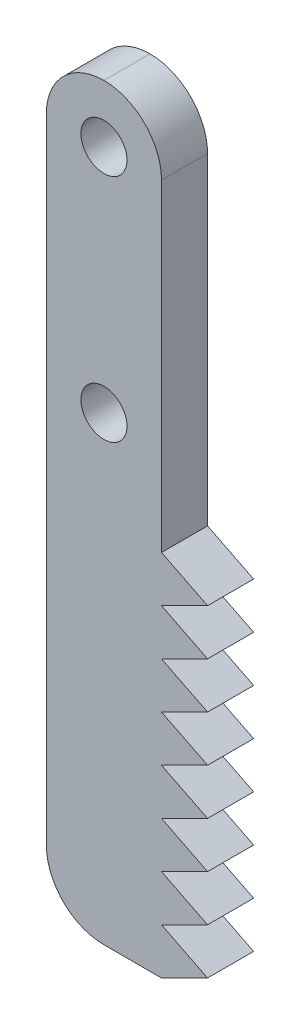
ISO-10303-21;
HEADER;
FILE_DESCRIPTION(('STEP AP214'),'2;1');
FILE_NAME('part.step','',(''),(''),'','','');
FILE_SCHEMA(('AUTOMOTIVE_DESIGN { 1 0 10303 214 1 1 1 1 }'));
ENDSEC;
DATA;
#1=APPLICATION_CONTEXT('core data for automotive mechanical design processes');
#2=APPLICATION_PROTOCOL_DEFINITION('international standard','automotive_design',2000,#1);
#3=PRODUCT_CONTEXT('',#1,'mechanical');
#4=PRODUCT('Part','Part','',(#3));
#5=PRODUCT_RELATED_PRODUCT_CATEGORY('part','',(#4));
#6=PRODUCT_DEFINITION_FORMATION('','',#4);
#7=PRODUCT_DEFINITION_CONTEXT('part definition',#1,'design');
#8=PRODUCT_DEFINITION('design','',#6,#7);
#9=PRODUCT_DEFINITION_SHAPE('','',#8);
#10=(LENGTH_UNIT() NAMED_UNIT(*) SI_UNIT(.MILLI.,.METRE.));
#11=(NAMED_UNIT(*) PLANE_ANGLE_UNIT() SI_UNIT($,.RADIAN.));
#12=(NAMED_UNIT(*) SI_UNIT($,.STERADIAN.) SOLID_ANGLE_UNIT());
#13=UNCERTAINTY_MEASURE_WITH_UNIT(LENGTH_MEASURE(1.E-05),#10,'distance_accuracy_value','');
#14=(GEOMETRIC_REPRESENTATION_CONTEXT(3) GLOBAL_UNCERTAINTY_ASSIGNED_CONTEXT((#13)) GLOBAL_UNIT_ASSIGNED_CONTEXT((#10,
#11,#12)) REPRESENTATION_CONTEXT('',''));
#15=CARTESIAN_POINT('',(0.,0.,0.));
#16=DIRECTION('',(0.,0.,1.));
#17=DIRECTION('',(1.,0.,0.));
#18=AXIS2_PLACEMENT_3D('',#15,#16,#17);
#19=CARTESIAN_POINT('',(-25.,0.,20.));
#20=DIRECTION('',(1.,0.,0.));
#21=DIRECTION('',(0.,1.,0.));
#22=AXIS2_PLACEMENT_3D('',#19,#20,#21);
#23=PLANE('',#22);
#24=DIRECTION('',(0.,-1.,0.));
#25=VECTOR('',#24,1.);
#26=CARTESIAN_POINT('',(-25.,0.,0.));
#27=LINE('',#26,#25);
#28=CARTESIAN_POINT('',(-25.,137.5,0.));
#29=VERTEX_POINT('',#28);
#30=CARTESIAN_POINT('',(-25.,-137.5,0.));
#31=VERTEX_POINT('',#30);
#32=EDGE_CURVE('E244',#29,#31,#27,.T.);
#33=ORIENTED_EDGE('',*,*,#32,.T.);
#34=DIRECTION('',(0.,0.,-1.));
#35=VECTOR('',#34,1.);
#36=CARTESIAN_POINT('',(-25.,-137.5,20.));
#37=LINE('',#36,#35);
#38=CARTESIAN_POINT('',(-25.,-137.5,20.));
#39=VERTEX_POINT('',#38);
#40=EDGE_CURVE('E223',#31,#39,#37,.F.);
#41=ORIENTED_EDGE('',*,*,#40,.T.);
#42=DIRECTION('',(0.,-1.,0.));
#43=VECTOR('',#42,1.);
#44=CARTESIAN_POINT('',(-25.,0.,20.));
#45=LINE('',#44,#43);
#46=CARTESIAN_POINT('',(-25.,137.5,20.));
#47=VERTEX_POINT('',#46);
#48=EDGE_CURVE('E193',#47,#39,#45,.T.);
#49=ORIENTED_EDGE('',*,*,#48,.F.);
#50=DIRECTION('',(0.,0.,-1.));
#51=VECTOR('',#50,1.);
#52=CARTESIAN_POINT('',(-25.,137.5,0.));
#53=LINE('',#52,#51);
#54=EDGE_CURVE('E221',#47,#29,#53,.T.);
#55=ORIENTED_EDGE('',*,*,#54,.T.);
#56=EDGE_LOOP('',(#33,#41,#49,#55));
#57=FACE_BOUND('',#56,.T.);
#58=ADVANCED_FACE('F32',(#57),#23,.F.);
#59=CARTESIAN_POINT('',(0.,-162.5,20.));
#60=DIRECTION('',(0.,1.,0.));
#61=DIRECTION('',(0.,0.,1.));
#62=AXIS2_PLACEMENT_3D('',#59,#60,#61);
#63=PLANE('',#62);
#64=DIRECTION('',(1.,0.,0.));
#65=VECTOR('',#64,1.);
#66=CARTESIAN_POINT('',(0.,-162.5,20.));
#67=LINE('',#66,#65);
#68=CARTESIAN_POINT('',(0.,-162.5,20.));
#69=VERTEX_POINT('',#68);
#70=CARTESIAN_POINT('',(25.,-162.5,20.));
#71=VERTEX_POINT('',#70);
#72=EDGE_CURVE('E180',#69,#71,#67,.T.);
#73=ORIENTED_EDGE('',*,*,#72,.F.);
#74=DIRECTION('',(0.,0.,-1.));
#75=VECTOR('',#74,1.);
#76=CARTESIAN_POINT('',(0.,-162.5,20.));
#77=LINE('',#76,#75);
#78=CARTESIAN_POINT('',(0.,-162.5,0.));
#79=VERTEX_POINT('',#78);
#80=EDGE_CURVE('E208',#69,#79,#77,.T.);
#81=ORIENTED_EDGE('',*,*,#80,.T.);
#82=DIRECTION('',(1.,0.,0.));
#83=VECTOR('',#82,1.);
#84=CARTESIAN_POINT('',(0.,-162.5,0.));
#85=LINE('',#84,#83);
#86=CARTESIAN_POINT('',(25.,-162.5,0.));
#87=VERTEX_POINT('',#86);
#88=EDGE_CURVE('E206',#79,#87,#85,.T.);
#89=ORIENTED_EDGE('',*,*,#88,.T.);
#90=DIRECTION('',(0.,0.,-1.));
#91=VECTOR('',#90,1.);
#92=CARTESIAN_POINT('',(25.,-162.5,20.));
#93=LINE('',#92,#91);
#94=EDGE_CURVE('E199',#71,#87,#93,.T.);
#95=ORIENTED_EDGE('',*,*,#94,.F.);
#96=EDGE_LOOP('',(#73,#81,#89,#95));
#97=FACE_BOUND('',#96,.T.);
#98=ADVANCED_FACE('F204',(#97),#63,.F.);
#99=CARTESIAN_POINT('',(70.,-140.,20.));
#100=DIRECTION('',(-0.447213595499958,0.894427190999916,0.));
#101=DIRECTION('',(-0.894427190999916,-0.447213595499958,0.));
#102=AXIS2_PLACEMENT_3D('',#99,#100,#101);
#103=PLANE('',#102);
#104=DIRECTION('',(0.894427190999916,0.447213595499958,0.));
#105=VECTOR('',#104,1.);
#106=CARTESIAN_POINT('',(70.,-140.,0.));
#107=LINE('',#106,#105);
#108=CARTESIAN_POINT('',(45.,-152.5,0.));
#109=VERTEX_POINT('',#108);
#110=EDGE_CURVE('E247',#87,#109,#107,.T.);
#111=ORIENTED_EDGE('',*,*,#110,.T.);
#112=DIRECTION('',(0.,0.,-1.));
#113=VECTOR('',#112,1.);
#114=CARTESIAN_POINT('',(45.,-152.5,20.));
#115=LINE('',#114,#113);
#116=CARTESIAN_POINT('',(45.,-152.5,20.));
#117=VERTEX_POINT('',#116);
#118=EDGE_CURVE('E201',#117,#109,#115,.T.);
#119=ORIENTED_EDGE('',*,*,#118,.F.);
#120=DIRECTION('',(0.894427190999916,0.447213595499958,0.));
#121=VECTOR('',#120,1.);
#122=CARTESIAN_POINT('',(70.,-140.,20.));
#123=LINE('',#122,#121);
#124=EDGE_CURVE('E186',#71,#117,#123,.T.);
#125=ORIENTED_EDGE('',*,*,#124,.F.);
#126=ORIENTED_EDGE('',*,*,#94,.T.);
#127=EDGE_LOOP('',(#111,#119,#125,#126));
#128=FACE_BOUND('',#127,.T.);
#129=ADVANCED_FACE('F198',(#128),#103,.F.);
#130=CARTESIAN_POINT('',(-52.,-104.,20.));
#131=DIRECTION('',(-0.447213595499958,-0.894427190999916,0.));
#132=DIRECTION('',(0.894427190999916,-0.447213595499958,0.));
#133=AXIS2_PLACEMENT_3D('',#130,#131,#132);
#134=PLANE('',#133);
#135=DIRECTION('',(-0.894427190999916,0.447213595499958,0.));
#136=VECTOR('',#135,1.);
#137=CARTESIAN_POINT('',(-52.,-104.,0.));
#138=LINE('',#137,#136);
#139=CARTESIAN_POINT('',(25.,-142.5,0.));
#140=VERTEX_POINT('',#139);
#141=EDGE_CURVE('E254',#109,#140,#138,.T.);
#142=ORIENTED_EDGE('',*,*,#141,.T.);
#143=DIRECTION('',(0.,0.,-1.));
#144=VECTOR('',#143,1.);
#145=CARTESIAN_POINT('',(25.,-142.5,20.));
#146=LINE('',#145,#144);
#147=CARTESIAN_POINT('',(25.,-142.5,20.));
#148=VERTEX_POINT('',#147);
#149=EDGE_CURVE('E212',#148,#140,#146,.T.);
#150=ORIENTED_EDGE('',*,*,#149,.F.);
#151=DIRECTION('',(-0.894427190999916,0.447213595499958,0.));
#152=VECTOR('',#151,1.);
#153=CARTESIAN_POINT('',(-52.,-104.,20.));
#154=LINE('',#153,#152);
#155=EDGE_CURVE('E202',#117,#148,#154,.T.);
#156=ORIENTED_EDGE('',*,*,#155,.F.);
#157=ORIENTED_EDGE('',*,*,#118,.T.);
#158=EDGE_LOOP('',(#142,#150,#156,#157));
#159=FACE_BOUND('',#158,.T.);
#160=ADVANCED_FACE('F354',(#159),#134,.F.);
#161=CARTESIAN_POINT('',(61.9999999999998,-124.,20.));
#162=DIRECTION('',(-0.447213595499957,0.894427190999917,0.));
#163=DIRECTION('',(-0.894427190999917,-0.447213595499957,0.));
#164=AXIS2_PLACEMENT_3D('',#161,#162,#163);
#165=PLANE('',#164);
#166=DIRECTION('',(0.894427190999917,0.447213595499957,0.));
#167=VECTOR('',#166,1.);
#168=CARTESIAN_POINT('',(61.9999999999998,-124.,0.));
#169=LINE('',#168,#167);
#170=CARTESIAN_POINT('',(45.,-132.5,0.));
#171=VERTEX_POINT('',#170);
#172=EDGE_CURVE('E257',#140,#171,#169,.T.);
#173=ORIENTED_EDGE('',*,*,#172,.T.);
#174=DIRECTION('',(0.,0.,-1.));
#175=VECTOR('',#174,1.);
#176=CARTESIAN_POINT('',(45.,-132.5,20.));
#177=LINE('',#176,#175);
#178=CARTESIAN_POINT('',(45.,-132.5,20.));
#179=VERTEX_POINT('',#178);
#180=EDGE_CURVE('E344',#179,#171,#177,.T.);
#181=ORIENTED_EDGE('',*,*,#180,.F.);
#182=DIRECTION('',(0.894427190999917,0.447213595499957,0.));
#183=VECTOR('',#182,1.);
#184=CARTESIAN_POINT('',(61.9999999999998,-124.,20.));
#185=LINE('',#184,#183);
#186=EDGE_CURVE('E352',#148,#179,#185,.T.);
#187=ORIENTED_EDGE('',*,*,#186,.F.);
#188=ORIENTED_EDGE('',*,*,#149,.T.);
#189=EDGE_LOOP('',(#173,#181,#187,#188));
#190=FACE_BOUND('',#189,.T.);
#191=ADVANCED_FACE('F349',(#190),#165,.F.);
#192=CARTESIAN_POINT('',(-44.,-87.9999999999998,20.));
#193=DIRECTION('',(-0.447213595499959,-0.894427190999915,0.));
#194=DIRECTION('',(0.894427190999915,-0.447213595499959,0.));
#195=AXIS2_PLACEMENT_3D('',#192,#193,#194);
#196=PLANE('',#195);
#197=DIRECTION('',(-0.894427190999915,0.447213595499959,0.));
#198=VECTOR('',#197,1.);
#199=CARTESIAN_POINT('',(-44.,-87.9999999999998,0.));
#200=LINE('',#199,#198);
#201=CARTESIAN_POINT('',(25.,-122.5,0.));
#202=VERTEX_POINT('',#201);
#203=EDGE_CURVE('E260',#171,#202,#200,.T.);
#204=ORIENTED_EDGE('',*,*,#203,.T.);
#205=DIRECTION('',(0.,0.,-1.));
#206=VECTOR('',#205,1.);
#207=CARTESIAN_POINT('',(25.,-122.5,20.));
#208=LINE('',#207,#206);
#209=CARTESIAN_POINT('',(25.,-122.5,20.));
#210=VERTEX_POINT('',#209);
#211=EDGE_CURVE('E341',#210,#202,#208,.T.);
#212=ORIENTED_EDGE('',*,*,#211,.F.);
#213=DIRECTION('',(-0.894427190999915,0.447213595499959,0.));
#214=VECTOR('',#213,1.);
#215=CARTESIAN_POINT('',(-44.,-87.9999999999998,20.));
#216=LINE('',#215,#214);
#217=EDGE_CURVE('E359',#179,#210,#216,.T.);
#218=ORIENTED_EDGE('',*,*,#217,.F.);
#219=ORIENTED_EDGE('',*,*,#180,.T.);
#220=EDGE_LOOP('',(#204,#212,#218,#219));
#221=FACE_BOUND('',#220,.T.);
#222=ADVANCED_FACE('F357',(#221),#196,.F.);
#223=CARTESIAN_POINT('',(53.9999999999998,-108.,20.));
#224=DIRECTION('',(-0.447213595499957,0.894427190999917,0.));
#225=DIRECTION('',(-0.894427190999917,-0.447213595499957,0.));
#226=AXIS2_PLACEMENT_3D('',#223,#224,#225);
#227=PLANE('',#226);
#228=DIRECTION('',(0.894427190999917,0.447213595499957,0.));
#229=VECTOR('',#228,1.);
#230=CARTESIAN_POINT('',(53.9999999999998,-108.,0.));
#231=LINE('',#230,#229);
#232=CARTESIAN_POINT('',(45.,-112.5,0.));
#233=VERTEX_POINT('',#232);
#234=EDGE_CURVE('E263',#202,#233,#231,.T.);
#235=ORIENTED_EDGE('',*,*,#234,.T.);
#236=DIRECTION('',(0.,0.,-1.));
#237=VECTOR('',#236,1.);
#238=CARTESIAN_POINT('',(45.,-112.5,20.));
#239=LINE('',#238,#237);
#240=CARTESIAN_POINT('',(45.,-112.5,20.));
#241=VERTEX_POINT('',#240);
#242=EDGE_CURVE('E338',#241,#233,#239,.T.);
#243=ORIENTED_EDGE('',*,*,#242,.F.);
#244=DIRECTION('',(0.894427190999917,0.447213595499957,0.));
#245=VECTOR('',#244,1.);
#246=CARTESIAN_POINT('',(53.9999999999998,-108.,20.));
#247=LINE('',#246,#245);
#248=EDGE_CURVE('E361',#210,#241,#247,.T.);
#249=ORIENTED_EDGE('',*,*,#248,.F.);
#250=ORIENTED_EDGE('',*,*,#211,.T.);
#251=EDGE_LOOP('',(#235,#243,#249,#250));
#252=FACE_BOUND('',#251,.T.);
#253=ADVANCED_FACE('F599',(#252),#227,.F.);
#254=CARTESIAN_POINT('',(-35.9999999999999,-72.0000000000002,20.));
#255=DIRECTION('',(-0.447213595499956,-0.894427190999917,0.));
#256=DIRECTION('',(0.894427190999917,-0.447213595499956,0.));
#257=AXIS2_PLACEMENT_3D('',#254,#255,#256);
#258=PLANE('',#257);
#259=DIRECTION('',(-0.894427190999917,0.447213595499956,0.));
#260=VECTOR('',#259,1.);
#261=CARTESIAN_POINT('',(-35.9999999999999,-72.0000000000002,0.));
#262=LINE('',#261,#260);
#263=CARTESIAN_POINT('',(25.,-102.5,0.));
#264=VERTEX_POINT('',#263);
#265=EDGE_CURVE('E266',#233,#264,#262,.T.);
#266=ORIENTED_EDGE('',*,*,#265,.T.);
#267=DIRECTION('',(0.,0.,-1.));
#268=VECTOR('',#267,1.);
#269=CARTESIAN_POINT('',(25.,-102.5,20.));
#270=LINE('',#269,#268);
#271=CARTESIAN_POINT('',(25.,-102.5,20.));
#272=VERTEX_POINT('',#271);
#273=EDGE_CURVE('E335',#272,#264,#270,.T.);
#274=ORIENTED_EDGE('',*,*,#273,.F.);
#275=DIRECTION('',(-0.894427190999917,0.447213595499956,0.));
#276=VECTOR('',#275,1.);
#277=CARTESIAN_POINT('',(-35.9999999999999,-72.0000000000002,20.));
#278=LINE('',#277,#276);
#279=EDGE_CURVE('E367',#241,#272,#278,.T.);
#280=ORIENTED_EDGE('',*,*,#279,.F.);
#281=ORIENTED_EDGE('',*,*,#242,.T.);
#282=EDGE_LOOP('',(#266,#274,#280,#281));
#283=FACE_BOUND('',#282,.T.);
#284=ADVANCED_FACE('F589',(#283),#258,.F.);
#285=CARTESIAN_POINT('',(46.,-92.,20.));
#286=DIRECTION('',(-0.447213595499958,0.894427190999916,0.));
#287=DIRECTION('',(-0.894427190999916,-0.447213595499958,0.));
#288=AXIS2_PLACEMENT_3D('',#285,#286,#287);
#289=PLANE('',#288);
#290=DIRECTION('',(0.894427190999916,0.447213595499958,0.));
#291=VECTOR('',#290,1.);
#292=CARTESIAN_POINT('',(46.,-92.,0.));
#293=LINE('',#292,#291);
#294=CARTESIAN_POINT('',(45.,-92.5,0.));
#295=VERTEX_POINT('',#294);
#296=EDGE_CURVE('E269',#264,#295,#293,.T.);
#297=ORIENTED_EDGE('',*,*,#296,.T.);
#298=DIRECTION('',(0.,0.,-1.));
#299=VECTOR('',#298,1.);
#300=CARTESIAN_POINT('',(45.,-92.5,20.));
#301=LINE('',#300,#299);
#302=CARTESIAN_POINT('',(45.,-92.5,20.));
#303=VERTEX_POINT('',#302);
#304=EDGE_CURVE('E332',#303,#295,#301,.T.);
#305=ORIENTED_EDGE('',*,*,#304,.F.);
#306=DIRECTION('',(0.894427190999916,0.447213595499958,0.));
#307=VECTOR('',#306,1.);
#308=CARTESIAN_POINT('',(46.,-92.,20.));
#309=LINE('',#308,#307);
#310=EDGE_CURVE('E370',#272,#303,#309,.T.);
#311=ORIENTED_EDGE('',*,*,#310,.F.);
#312=ORIENTED_EDGE('',*,*,#273,.T.);
#313=EDGE_LOOP('',(#297,#305,#311,#312));
#314=FACE_BOUND('',#313,.T.);
#315=ADVANCED_FACE('F579',(#314),#289,.F.);
#316=CARTESIAN_POINT('',(-28.,-56.0000000000002,20.));
#317=DIRECTION('',(-0.447213595499956,-0.894427190999917,0.));
#318=DIRECTION('',(0.894427190999917,-0.447213595499956,0.));
#319=AXIS2_PLACEMENT_3D('',#316,#317,#318);
#320=PLANE('',#319);
#321=DIRECTION('',(-0.894427190999917,0.447213595499956,0.));
#322=VECTOR('',#321,1.);
#323=CARTESIAN_POINT('',(-28.,-56.0000000000002,0.));
#324=LINE('',#323,#322);
#325=CARTESIAN_POINT('',(25.,-82.5,0.));
#326=VERTEX_POINT('',#325);
#327=EDGE_CURVE('E272',#295,#326,#324,.T.);
#328=ORIENTED_EDGE('',*,*,#327,.T.);
#329=DIRECTION('',(0.,0.,-1.));
#330=VECTOR('',#329,1.);
#331=CARTESIAN_POINT('',(25.,-82.5,20.));
#332=LINE('',#331,#330);
#333=CARTESIAN_POINT('',(25.,-82.5,20.));
#334=VERTEX_POINT('',#333);
#335=EDGE_CURVE('E329',#334,#326,#332,.T.);
#336=ORIENTED_EDGE('',*,*,#335,.F.);
#337=DIRECTION('',(-0.894427190999917,0.447213595499956,0.));
#338=VECTOR('',#337,1.);
#339=CARTESIAN_POINT('',(-28.,-56.0000000000002,20.));
#340=LINE('',#339,#338);
#341=EDGE_CURVE('E373',#303,#334,#340,.T.);
#342=ORIENTED_EDGE('',*,*,#341,.F.);
#343=ORIENTED_EDGE('',*,*,#304,.T.);
#344=EDGE_LOOP('',(#328,#336,#342,#343));
#345=FACE_BOUND('',#344,.T.);
#346=ADVANCED_FACE('F569',(#345),#320,.F.);
#347=CARTESIAN_POINT('',(38.,-76.,20.));
#348=DIRECTION('',(-0.447213595499958,0.894427190999916,0.));
#349=DIRECTION('',(-0.894427190999916,-0.447213595499958,0.));
#350=AXIS2_PLACEMENT_3D('',#347,#348,#349);
#351=PLANE('',#350);
#352=DIRECTION('',(0.894427190999916,0.447213595499958,0.));
#353=VECTOR('',#352,1.);
#354=CARTESIAN_POINT('',(38.,-76.,0.));
#355=LINE('',#354,#353);
#356=CARTESIAN_POINT('',(45.,-72.5,0.));
#357=VERTEX_POINT('',#356);
#358=EDGE_CURVE('E275',#326,#357,#355,.T.);
#359=ORIENTED_EDGE('',*,*,#358,.T.);
#360=DIRECTION('',(0.,0.,-1.));
#361=VECTOR('',#360,1.);
#362=CARTESIAN_POINT('',(45.,-72.5,20.));
#363=LINE('',#362,#361);
#364=CARTESIAN_POINT('',(45.,-72.5,20.));
#365=VERTEX_POINT('',#364);
#366=EDGE_CURVE('E326',#365,#357,#363,.T.);
#367=ORIENTED_EDGE('',*,*,#366,.F.);
#368=DIRECTION('',(0.894427190999916,0.447213595499958,0.));
#369=VECTOR('',#368,1.);
#370=CARTESIAN_POINT('',(38.,-76.,20.));
#371=LINE('',#370,#369);
#372=EDGE_CURVE('E376',#334,#365,#371,.T.);
#373=ORIENTED_EDGE('',*,*,#372,.F.);
#374=ORIENTED_EDGE('',*,*,#335,.T.);
#375=EDGE_LOOP('',(#359,#367,#373,#374));
#376=FACE_BOUND('',#375,.T.);
#377=ADVANCED_FACE('F559',(#376),#351,.F.);
#378=CARTESIAN_POINT('',(-20.,-40.0000000000002,20.));
#379=DIRECTION('',(-0.447213595499956,-0.894427190999917,0.));
#380=DIRECTION('',(0.894427190999917,-0.447213595499956,0.));
#381=AXIS2_PLACEMENT_3D('',#378,#379,#380);
#382=PLANE('',#381);
#383=DIRECTION('',(-0.894427190999917,0.447213595499956,0.));
#384=VECTOR('',#383,1.);
#385=CARTESIAN_POINT('',(-20.,-40.0000000000002,0.));
#386=LINE('',#385,#384);
#387=CARTESIAN_POINT('',(25.,-62.5000000000001,0.));
#388=VERTEX_POINT('',#387);
#389=EDGE_CURVE('E278',#357,#388,#386,.T.);
#390=ORIENTED_EDGE('',*,*,#389,.T.);
#391=DIRECTION('',(0.,0.,-1.));
#392=VECTOR('',#391,1.);
#393=CARTESIAN_POINT('',(25.,-62.5000000000001,20.));
#394=LINE('',#393,#392);
#395=CARTESIAN_POINT('',(25.,-62.5000000000001,20.));
#396=VERTEX_POINT('',#395);
#397=EDGE_CURVE('E323',#396,#388,#394,.T.);
#398=ORIENTED_EDGE('',*,*,#397,.F.);
#399=DIRECTION('',(-0.894427190999917,0.447213595499956,0.));
#400=VECTOR('',#399,1.);
#401=CARTESIAN_POINT('',(-20.,-40.0000000000002,20.));
#402=LINE('',#401,#400);
#403=EDGE_CURVE('E379',#365,#396,#402,.T.);
#404=ORIENTED_EDGE('',*,*,#403,.F.);
#405=ORIENTED_EDGE('',*,*,#366,.T.);
#406=EDGE_LOOP('',(#390,#398,#404,#405));
#407=FACE_BOUND('',#406,.T.);
#408=ADVANCED_FACE('F549',(#407),#382,.F.);
#409=CARTESIAN_POINT('',(30.,-60.,20.));
#410=DIRECTION('',(-0.447213595499958,0.894427190999916,0.));
#411=DIRECTION('',(-0.894427190999916,-0.447213595499958,0.));
#412=AXIS2_PLACEMENT_3D('',#409,#410,#411);
#413=PLANE('',#412);
#414=DIRECTION('',(0.894427190999916,0.447213595499958,0.));
#415=VECTOR('',#414,1.);
#416=CARTESIAN_POINT('',(30.,-60.,0.));
#417=LINE('',#416,#415);
#418=CARTESIAN_POINT('',(44.9999999999999,-52.5,0.));
#419=VERTEX_POINT('',#418);
#420=EDGE_CURVE('E281',#388,#419,#417,.T.);
#421=ORIENTED_EDGE('',*,*,#420,.T.);
#422=DIRECTION('',(0.,0.,-1.));
#423=VECTOR('',#422,1.);
#424=CARTESIAN_POINT('',(44.9999999999999,-52.5,20.));
#425=LINE('',#424,#423);
#426=CARTESIAN_POINT('',(44.9999999999999,-52.5,20.));
#427=VERTEX_POINT('',#426);
#428=EDGE_CURVE('E320',#427,#419,#425,.T.);
#429=ORIENTED_EDGE('',*,*,#428,.F.);
#430=DIRECTION('',(0.894427190999916,0.447213595499958,0.));
#431=VECTOR('',#430,1.);
#432=CARTESIAN_POINT('',(30.,-60.,20.));
#433=LINE('',#432,#431);
#434=EDGE_CURVE('E382',#396,#427,#433,.T.);
#435=ORIENTED_EDGE('',*,*,#434,.F.);
#436=ORIENTED_EDGE('',*,*,#397,.T.);
#437=EDGE_LOOP('',(#421,#429,#435,#436));
#438=FACE_BOUND('',#437,.T.);
#439=ADVANCED_FACE('F539',(#438),#413,.F.);
#440=CARTESIAN_POINT('',(-12.,-24.0000000000002,20.));
#441=DIRECTION('',(-0.447213595499957,-0.894427190999917,0.));
#442=DIRECTION('',(0.894427190999917,-0.447213595499957,0.));
#443=AXIS2_PLACEMENT_3D('',#440,#441,#442);
#444=PLANE('',#443);
#445=DIRECTION('',(-0.894427190999917,0.447213595499957,0.));
#446=VECTOR('',#445,1.);
#447=CARTESIAN_POINT('',(-12.,-24.0000000000002,0.));
#448=LINE('',#447,#446);
#449=CARTESIAN_POINT('',(25.,-42.5000000000001,0.));
#450=VERTEX_POINT('',#449);
#451=EDGE_CURVE('E284',#419,#450,#448,.T.);
#452=ORIENTED_EDGE('',*,*,#451,.T.);
#453=DIRECTION('',(0.,0.,-1.));
#454=VECTOR('',#453,1.);
#455=CARTESIAN_POINT('',(25.,-42.5000000000001,20.));
#456=LINE('',#455,#454);
#457=CARTESIAN_POINT('',(25.,-42.5000000000001,20.));
#458=VERTEX_POINT('',#457);
#459=EDGE_CURVE('E317',#458,#450,#456,.T.);
#460=ORIENTED_EDGE('',*,*,#459,.F.);
#461=DIRECTION('',(-0.894427190999917,0.447213595499957,0.));
#462=VECTOR('',#461,1.);
#463=CARTESIAN_POINT('',(-12.,-24.0000000000002,20.));
#464=LINE('',#463,#462);
#465=EDGE_CURVE('E385',#427,#458,#464,.T.);
#466=ORIENTED_EDGE('',*,*,#465,.F.);
#467=ORIENTED_EDGE('',*,*,#428,.T.);
#468=EDGE_LOOP('',(#452,#460,#466,#467));
#469=FACE_BOUND('',#468,.T.);
#470=ADVANCED_FACE('F529',(#469),#444,.F.);
#471=CARTESIAN_POINT('',(22.,-44.,20.));
#472=DIRECTION('',(-0.447213595499958,0.894427190999916,0.));
#473=DIRECTION('',(-0.894427190999916,-0.447213595499958,0.));
#474=AXIS2_PLACEMENT_3D('',#471,#472,#473);
#475=PLANE('',#474);
#476=DIRECTION('',(0.894427190999916,0.447213595499958,0.));
#477=VECTOR('',#476,1.);
#478=CARTESIAN_POINT('',(22.,-44.,0.));
#479=LINE('',#478,#477);
#480=CARTESIAN_POINT('',(44.9999999999999,-32.5,0.));
#481=VERTEX_POINT('',#480);
#482=EDGE_CURVE('E287',#450,#481,#479,.T.);
#483=ORIENTED_EDGE('',*,*,#482,.T.);
#484=DIRECTION('',(0.,0.,-1.));
#485=VECTOR('',#484,1.);
#486=CARTESIAN_POINT('',(44.9999999999999,-32.5,20.));
#487=LINE('',#486,#485);
#488=CARTESIAN_POINT('',(44.9999999999999,-32.5,20.));
#489=VERTEX_POINT('',#488);
#490=EDGE_CURVE('E314',#489,#481,#487,.T.);
#491=ORIENTED_EDGE('',*,*,#490,.F.);
#492=DIRECTION('',(0.894427190999916,0.447213595499958,0.));
#493=VECTOR('',#492,1.);
#494=CARTESIAN_POINT('',(22.,-44.,20.));
#495=LINE('',#494,#493);
#496=EDGE_CURVE('E388',#458,#489,#495,.T.);
#497=ORIENTED_EDGE('',*,*,#496,.F.);
#498=ORIENTED_EDGE('',*,*,#459,.T.);
#499=EDGE_LOOP('',(#483,#491,#497,#498));
#500=FACE_BOUND('',#499,.T.);
#501=ADVANCED_FACE('F519',(#500),#475,.F.);
#502=CARTESIAN_POINT('',(-4.00000000000006,-8.00000000000013,20.));
#503=DIRECTION('',(-0.447213595499957,-0.894427190999916,0.));
#504=DIRECTION('',(0.894427190999917,-0.447213595499957,0.));
#505=AXIS2_PLACEMENT_3D('',#502,#503,#504);
#506=PLANE('',#505);
#507=DIRECTION('',(-0.894427190999916,0.447213595499957,0.));
#508=VECTOR('',#507,1.);
#509=CARTESIAN_POINT('',(-4.00000000000006,-8.00000000000013,0.));
#510=LINE('',#509,#508);
#511=CARTESIAN_POINT('',(25.,-22.5000000000001,0.));
#512=VERTEX_POINT('',#511);
#513=EDGE_CURVE('E290',#481,#512,#510,.T.);
#514=ORIENTED_EDGE('',*,*,#513,.T.);
#515=DIRECTION('',(0.,0.,-1.));
#516=VECTOR('',#515,1.);
#517=CARTESIAN_POINT('',(25.,-22.5000000000001,20.));
#518=LINE('',#517,#516);
#519=CARTESIAN_POINT('',(25.,-22.5000000000001,20.));
#520=VERTEX_POINT('',#519);
#521=EDGE_CURVE('E311',#520,#512,#518,.T.);
#522=ORIENTED_EDGE('',*,*,#521,.F.);
#523=DIRECTION('',(-0.894427190999916,0.447213595499957,0.));
#524=VECTOR('',#523,1.);
#525=CARTESIAN_POINT('',(-4.00000000000006,-8.00000000000013,20.));
#526=LINE('',#525,#524);
#527=EDGE_CURVE('E391',#489,#520,#526,.T.);
#528=ORIENTED_EDGE('',*,*,#527,.F.);
#529=ORIENTED_EDGE('',*,*,#490,.T.);
#530=EDGE_LOOP('',(#514,#522,#528,#529));
#531=FACE_BOUND('',#530,.T.);
#532=ADVANCED_FACE('F509',(#531),#506,.F.);
#533=CARTESIAN_POINT('',(14.,-28.,20.));
#534=DIRECTION('',(-0.447213595499958,0.894427190999916,0.));
#535=DIRECTION('',(-0.894427190999916,-0.447213595499958,0.));
#536=AXIS2_PLACEMENT_3D('',#533,#534,#535);
#537=PLANE('',#536);
#538=DIRECTION('',(0.894427190999916,0.447213595499958,0.));
#539=VECTOR('',#538,1.);
#540=CARTESIAN_POINT('',(14.,-28.,0.));
#541=LINE('',#540,#539);
#542=CARTESIAN_POINT('',(44.9999999999999,-12.5000000000001,0.));
#543=VERTEX_POINT('',#542);
#544=EDGE_CURVE('E293',#512,#543,#541,.T.);
#545=ORIENTED_EDGE('',*,*,#544,.T.);
#546=DIRECTION('',(0.,0.,-1.));
#547=VECTOR('',#546,1.);
#548=CARTESIAN_POINT('',(44.9999999999999,-12.5000000000001,20.));
#549=LINE('',#548,#547);
#550=CARTESIAN_POINT('',(44.9999999999999,-12.5000000000001,20.));
#551=VERTEX_POINT('',#550);
#552=EDGE_CURVE('E307',#551,#543,#549,.T.);
#553=ORIENTED_EDGE('',*,*,#552,.F.);
#554=DIRECTION('',(0.894427190999916,0.447213595499958,0.));
#555=VECTOR('',#554,1.);
#556=CARTESIAN_POINT('',(14.,-28.,20.));
#557=LINE('',#556,#555);
#558=EDGE_CURVE('E394',#520,#551,#557,.T.);
#559=ORIENTED_EDGE('',*,*,#558,.F.);
#560=ORIENTED_EDGE('',*,*,#521,.T.);
#561=EDGE_LOOP('',(#545,#553,#559,#560));
#562=FACE_BOUND('',#561,.T.);
#563=ADVANCED_FACE('F499',(#562),#537,.F.);
#564=CARTESIAN_POINT('',(3.99999999999995,7.9999999999999,20.));
#565=DIRECTION('',(-0.447213595499958,-0.894427190999916,0.));
#566=DIRECTION('',(0.894427190999916,-0.447213595499958,0.));
#567=AXIS2_PLACEMENT_3D('',#564,#565,#566);
#568=PLANE('',#567);
#569=DIRECTION('',(-0.894427190999916,0.447213595499958,0.));
#570=VECTOR('',#569,1.);
#571=CARTESIAN_POINT('',(3.99999999999995,7.9999999999999,0.));
#572=LINE('',#571,#570);
#573=CARTESIAN_POINT('',(25.,-2.50000000000012,0.));
#574=VERTEX_POINT('',#573);
#575=EDGE_CURVE('E296',#543,#574,#572,.T.);
#576=ORIENTED_EDGE('',*,*,#575,.T.);
#577=DIRECTION('',(0.,0.,-1.));
#578=VECTOR('',#577,1.);
#579=CARTESIAN_POINT('',(25.,-2.50000000000012,20.));
#580=LINE('',#579,#578);
#581=CARTESIAN_POINT('',(25.,-2.50000000000012,20.));
#582=VERTEX_POINT('',#581);
#583=EDGE_CURVE('E304',#582,#574,#580,.T.);
#584=ORIENTED_EDGE('',*,*,#583,.F.);
#585=DIRECTION('',(-0.894427190999916,0.447213595499958,0.));
#586=VECTOR('',#585,1.);
#587=CARTESIAN_POINT('',(3.99999999999995,7.9999999999999,20.));
#588=LINE('',#587,#586);
#589=EDGE_CURVE('E397',#551,#582,#588,.T.);
#590=ORIENTED_EDGE('',*,*,#589,.F.);
#591=ORIENTED_EDGE('',*,*,#552,.T.);
#592=EDGE_LOOP('',(#576,#584,#590,#591));
#593=FACE_BOUND('',#592,.T.);
#594=ADVANCED_FACE('F464',(#593),#568,.F.);
#595=CARTESIAN_POINT('',(25.,0.,20.));
#596=DIRECTION('',(1.,0.,0.));
#597=DIRECTION('',(0.,0.,-1.));
#598=AXIS2_PLACEMENT_3D('',#595,#596,#597);
#599=PLANE('',#598);
#600=DIRECTION('',(0.,-1.,0.));
#601=VECTOR('',#600,1.);
#602=CARTESIAN_POINT('',(25.,0.,0.));
#603=LINE('',#602,#601);
#604=CARTESIAN_POINT('',(25.,137.5,0.));
#605=VERTEX_POINT('',#604);
#606=EDGE_CURVE('E299',#605,#574,#603,.T.);
#607=ORIENTED_EDGE('',*,*,#606,.F.);
#608=DIRECTION('',(0.,0.,-1.));
#609=VECTOR('',#608,1.);
#610=CARTESIAN_POINT('',(25.,137.5,20.));
#611=LINE('',#610,#609);
#612=CARTESIAN_POINT('',(25.,137.5,20.));
#613=VERTEX_POINT('',#612);
#614=EDGE_CURVE('E11',#605,#613,#611,.F.);
#615=ORIENTED_EDGE('',*,*,#614,.T.);
#616=DIRECTION('',(0.,-1.,0.));
#617=VECTOR('',#616,1.);
#618=CARTESIAN_POINT('',(25.,0.,20.));
#619=LINE('',#618,#617);
#620=EDGE_CURVE('E400',#613,#582,#619,.T.);
#621=ORIENTED_EDGE('',*,*,#620,.T.);
#622=ORIENTED_EDGE('',*,*,#583,.T.);
#623=EDGE_LOOP('',(#607,#615,#621,#622));
#624=FACE_BOUND('',#623,.T.);
#625=ADVANCED_FACE('F429',(#624),#599,.T.);
#626=CARTESIAN_POINT('',(0.,37.4999999999999,20.));
#627=DIRECTION('',(0.,0.,-1.));
#628=DIRECTION('',(-1.,0.,0.));
#629=AXIS2_PLACEMENT_3D('',#626,#627,#628);
#630=CYLINDRICAL_SURFACE('',#629,10.);
#631=CARTESIAN_POINT('',(0.,37.4999999999999,20.));
#632=DIRECTION('',(0.,0.,1.));
#633=DIRECTION('',(1.,0.,0.));
#634=AXIS2_PLACEMENT_3D('',#631,#632,#633);
#635=CIRCLE('',#634,10.);
#636=CARTESIAN_POINT('',(10.,37.4999999999999,20.));
#637=VERTEX_POINT('',#636);
#638=EDGE_CURVE('E236',#637,#637,#635,.T.);
#639=ORIENTED_EDGE('',*,*,#638,.T.);
#640=EDGE_LOOP('',(#639));
#641=FACE_BOUND('',#640,.T.);
#642=CARTESIAN_POINT('',(0.,37.4999999999999,0.));
#643=DIRECTION('',(0.,0.,1.));
#644=DIRECTION('',(1.,0.,0.));
#645=AXIS2_PLACEMENT_3D('',#642,#643,#644);
#646=CIRCLE('',#645,10.);
#647=CARTESIAN_POINT('',(10.,37.4999999999999,0.));
#648=VERTEX_POINT('',#647);
#649=EDGE_CURVE('E245',#648,#648,#646,.T.);
#650=ORIENTED_EDGE('',*,*,#649,.F.);
#651=EDGE_LOOP('',(#650));
#652=FACE_BOUND('',#651,.T.);
#653=ADVANCED_FACE('F416',(#641,#652),#630,.F.);
#654=CARTESIAN_POINT('',(0.,137.5,20.));
#655=DIRECTION('',(0.,0.,-1.));
#656=DIRECTION('',(-1.,0.,0.));
#657=AXIS2_PLACEMENT_3D('',#654,#655,#656);
#658=CYLINDRICAL_SURFACE('',#657,10.);
#659=CARTESIAN_POINT('',(0.,137.5,20.));
#660=DIRECTION('',(0.,0.,1.));
#661=DIRECTION('',(1.,0.,0.));
#662=AXIS2_PLACEMENT_3D('',#659,#660,#661);
#663=CIRCLE('',#662,10.);
#664=CARTESIAN_POINT('',(10.,137.5,20.));
#665=VERTEX_POINT('',#664);
#666=EDGE_CURVE('E308',#665,#665,#663,.T.);
#667=ORIENTED_EDGE('',*,*,#666,.T.);
#668=EDGE_LOOP('',(#667));
#669=FACE_BOUND('',#668,.T.);
#670=CARTESIAN_POINT('',(0.,137.5,0.));
#671=DIRECTION('',(0.,0.,1.));
#672=DIRECTION('',(1.,0.,0.));
#673=AXIS2_PLACEMENT_3D('',#670,#671,#672);
#674=CIRCLE('',#673,10.);
#675=CARTESIAN_POINT('',(10.,137.5,0.));
#676=VERTEX_POINT('',#675);
#677=EDGE_CURVE('E301',#676,#676,#674,.T.);
#678=ORIENTED_EDGE('',*,*,#677,.F.);
#679=EDGE_LOOP('',(#678));
#680=FACE_BOUND('',#679,.T.);
#681=ADVANCED_FACE('F404',(#669,#680),#658,.F.);
#682=CARTESIAN_POINT('',(0.,0.,20.));
#683=DIRECTION('',(0.,0.,1.));
#684=DIRECTION('',(1.,0.,0.));
#685=AXIS2_PLACEMENT_3D('',#682,#683,#684);
#686=PLANE('',#685);
#687=ORIENTED_EDGE('',*,*,#638,.F.);
#688=EDGE_LOOP('',(#687));
#689=FACE_BOUND('',#688,.T.);
#690=ORIENTED_EDGE('',*,*,#48,.T.);
#691=CARTESIAN_POINT('',(0.,-137.5,20.));
#692=DIRECTION('',(0.,0.,1.));
#693=DIRECTION('',(1.,0.,0.));
#694=AXIS2_PLACEMENT_3D('',#691,#692,#693);
#695=CIRCLE('',#694,25.);
#696=EDGE_CURVE('E41',#39,#69,#695,.T.);
#697=ORIENTED_EDGE('',*,*,#696,.T.);
#698=ORIENTED_EDGE('',*,*,#72,.T.);
#699=ORIENTED_EDGE('',*,*,#124,.T.);
#700=ORIENTED_EDGE('',*,*,#155,.T.);
#701=ORIENTED_EDGE('',*,*,#186,.T.);
#702=ORIENTED_EDGE('',*,*,#217,.T.);
#703=ORIENTED_EDGE('',*,*,#248,.T.);
#704=ORIENTED_EDGE('',*,*,#279,.T.);
#705=ORIENTED_EDGE('',*,*,#310,.T.);
#706=ORIENTED_EDGE('',*,*,#341,.T.);
#707=ORIENTED_EDGE('',*,*,#372,.T.);
#708=ORIENTED_EDGE('',*,*,#403,.T.);
#709=ORIENTED_EDGE('',*,*,#434,.T.);
#710=ORIENTED_EDGE('',*,*,#465,.T.);
#711=ORIENTED_EDGE('',*,*,#496,.T.);
#712=ORIENTED_EDGE('',*,*,#527,.T.);
#713=ORIENTED_EDGE('',*,*,#558,.T.);
#714=ORIENTED_EDGE('',*,*,#589,.T.);
#715=ORIENTED_EDGE('',*,*,#620,.F.);
#716=CARTESIAN_POINT('',(0.,137.5,20.));
#717=DIRECTION('',(0.,0.,1.));
#718=DIRECTION('',(1.,0.,0.));
#719=AXIS2_PLACEMENT_3D('',#716,#717,#718);
#720=CIRCLE('',#719,25.);
#721=CARTESIAN_POINT('',(0.,162.5,20.));
#722=VERTEX_POINT('',#721);
#723=EDGE_CURVE('E48',#613,#722,#720,.T.);
#724=ORIENTED_EDGE('',*,*,#723,.T.);
#725=CARTESIAN_POINT('',(0.,137.5,20.));
#726=DIRECTION('',(0.,0.,1.));
#727=DIRECTION('',(1.,0.,0.));
#728=AXIS2_PLACEMENT_3D('',#725,#726,#727);
#729=CIRCLE('',#728,25.);
#730=EDGE_CURVE('E225',#722,#47,#729,.T.);
#731=ORIENTED_EDGE('',*,*,#730,.T.);
#732=EDGE_LOOP('',(#690,#697,#698,#699,#700,#701,#702,#703,#704,#705,#706,#707,#708,#709,#710,
#711,#712,#713,#714,#715,#724,#731));
#733=FACE_BOUND('',#732,.T.);
#734=ORIENTED_EDGE('',*,*,#666,.F.);
#735=EDGE_LOOP('',(#734));
#736=FACE_BOUND('',#735,.T.);
#737=ADVANCED_FACE('F183',(#689,#733,#736),#686,.T.);
#738=CARTESIAN_POINT('',(0.,0.,0.));
#739=DIRECTION('',(0.,0.,1.));
#740=DIRECTION('',(1.,0.,0.));
#741=AXIS2_PLACEMENT_3D('',#738,#739,#740);
#742=PLANE('',#741);
#743=ORIENTED_EDGE('',*,*,#649,.T.);
#744=EDGE_LOOP('',(#743));
#745=FACE_BOUND('',#744,.T.);
#746=ORIENTED_EDGE('',*,*,#88,.F.);
#747=CARTESIAN_POINT('',(0.,-137.5,0.));
#748=DIRECTION('',(0.,0.,1.));
#749=DIRECTION('',(1.,0.,0.));
#750=AXIS2_PLACEMENT_3D('',#747,#748,#749);
#751=CIRCLE('',#750,25.);
#752=EDGE_CURVE('E219',#79,#31,#751,.F.);
#753=ORIENTED_EDGE('',*,*,#752,.T.);
#754=ORIENTED_EDGE('',*,*,#32,.F.);
#755=CARTESIAN_POINT('',(0.,137.5,0.));
#756=DIRECTION('',(0.,0.,1.));
#757=DIRECTION('',(1.,0.,0.));
#758=AXIS2_PLACEMENT_3D('',#755,#756,#757);
#759=CIRCLE('',#758,25.);
#760=CARTESIAN_POINT('',(0.,162.5,0.));
#761=VERTEX_POINT('',#760);
#762=EDGE_CURVE('E210',#29,#761,#759,.F.);
#763=ORIENTED_EDGE('',*,*,#762,.T.);
#764=CARTESIAN_POINT('',(0.,137.5,0.));
#765=DIRECTION('',(0.,0.,1.));
#766=DIRECTION('',(1.,0.,0.));
#767=AXIS2_PLACEMENT_3D('',#764,#765,#766);
#768=CIRCLE('',#767,25.);
#769=EDGE_CURVE('E217',#761,#605,#768,.F.);
#770=ORIENTED_EDGE('',*,*,#769,.T.);
#771=ORIENTED_EDGE('',*,*,#606,.T.);
#772=ORIENTED_EDGE('',*,*,#575,.F.);
#773=ORIENTED_EDGE('',*,*,#544,.F.);
#774=ORIENTED_EDGE('',*,*,#513,.F.);
#775=ORIENTED_EDGE('',*,*,#482,.F.);
#776=ORIENTED_EDGE('',*,*,#451,.F.);
#777=ORIENTED_EDGE('',*,*,#420,.F.);
#778=ORIENTED_EDGE('',*,*,#389,.F.);
#779=ORIENTED_EDGE('',*,*,#358,.F.);
#780=ORIENTED_EDGE('',*,*,#327,.F.);
#781=ORIENTED_EDGE('',*,*,#296,.F.);
#782=ORIENTED_EDGE('',*,*,#265,.F.);
#783=ORIENTED_EDGE('',*,*,#234,.F.);
#784=ORIENTED_EDGE('',*,*,#203,.F.);
#785=ORIENTED_EDGE('',*,*,#172,.F.);
#786=ORIENTED_EDGE('',*,*,#141,.F.);
#787=ORIENTED_EDGE('',*,*,#110,.F.);
#788=EDGE_LOOP('',(#746,#753,#754,#763,#770,#771,#772,#773,#774,#775,#776,#777,#778,#779,#780,
#781,#782,#783,#784,#785,#786,#787));
#789=FACE_BOUND('',#788,.T.);
#790=ORIENTED_EDGE('',*,*,#677,.T.);
#791=EDGE_LOOP('',(#790));
#792=FACE_BOUND('',#791,.T.);
#793=ADVANCED_FACE('F241',(#745,#789,#792),#742,.F.);
#794=CARTESIAN_POINT('',(0.,-137.5,20.));
#795=DIRECTION('',(0.,0.,-1.));
#796=DIRECTION('',(-1.,0.,0.));
#797=AXIS2_PLACEMENT_3D('',#794,#795,#796);
#798=CYLINDRICAL_SURFACE('',#797,25.);
#799=ORIENTED_EDGE('',*,*,#696,.F.);
#800=ORIENTED_EDGE('',*,*,#40,.F.);
#801=ORIENTED_EDGE('',*,*,#752,.F.);
#802=ORIENTED_EDGE('',*,*,#80,.F.);
#803=EDGE_LOOP('',(#799,#800,#801,#802));
#804=FACE_BOUND('',#803,.T.);
#805=ADVANCED_FACE('F413',(#804),#798,.T.);
#806=CARTESIAN_POINT('',(0.,137.5,20.));
#807=DIRECTION('',(0.,0.,1.));
#808=DIRECTION('',(1.,0.,0.));
#809=AXIS2_PLACEMENT_3D('',#806,#807,#808);
#810=CYLINDRICAL_SURFACE('',#809,25.);
#811=ORIENTED_EDGE('',*,*,#54,.F.);
#812=ORIENTED_EDGE('',*,*,#730,.F.);
#813=DIRECTION('',(0.,0.,-1.));
#814=VECTOR('',#813,1.);
#815=CARTESIAN_POINT('',(0.,162.5,20.));
#816=LINE('',#815,#814);
#817=EDGE_CURVE('E36',#761,#722,#816,.F.);
#818=ORIENTED_EDGE('',*,*,#817,.F.);
#819=ORIENTED_EDGE('',*,*,#762,.F.);
#820=EDGE_LOOP('',(#811,#812,#818,#819));
#821=FACE_BOUND('',#820,.T.);
#822=ADVANCED_FACE('F34',(#821),#810,.T.);
#823=CARTESIAN_POINT('',(0.,137.5,20.));
#824=DIRECTION('',(0.,0.,-1.));
#825=DIRECTION('',(-1.,0.,0.));
#826=AXIS2_PLACEMENT_3D('',#823,#824,#825);
#827=CYLINDRICAL_SURFACE('',#826,25.);
#828=ORIENTED_EDGE('',*,*,#723,.F.);
#829=ORIENTED_EDGE('',*,*,#614,.F.);
#830=ORIENTED_EDGE('',*,*,#769,.F.);
#831=ORIENTED_EDGE('',*,*,#817,.T.);
#832=EDGE_LOOP('',(#828,#829,#830,#831));
#833=FACE_BOUND('',#832,.T.);
#834=ADVANCED_FACE('F433',(#833),#827,.T.);
#835=CLOSED_SHELL('',(#58,#98,#129,#160,#191,#222,#253,#284,#315,#346,#377,#408,#439,#470,#501,
#532,#563,#594,#625,#653,#681,#737,#793,#805,#822,#834));
#836=MANIFOLD_SOLID_BREP('B2',#835);
#837=ADVANCED_BREP_SHAPE_REPRESENTATION('',(#18,#836),#14);
#838=SHAPE_DEFINITION_REPRESENTATION(#9,#837);
ENDSEC;
END-ISO-10303-21;
